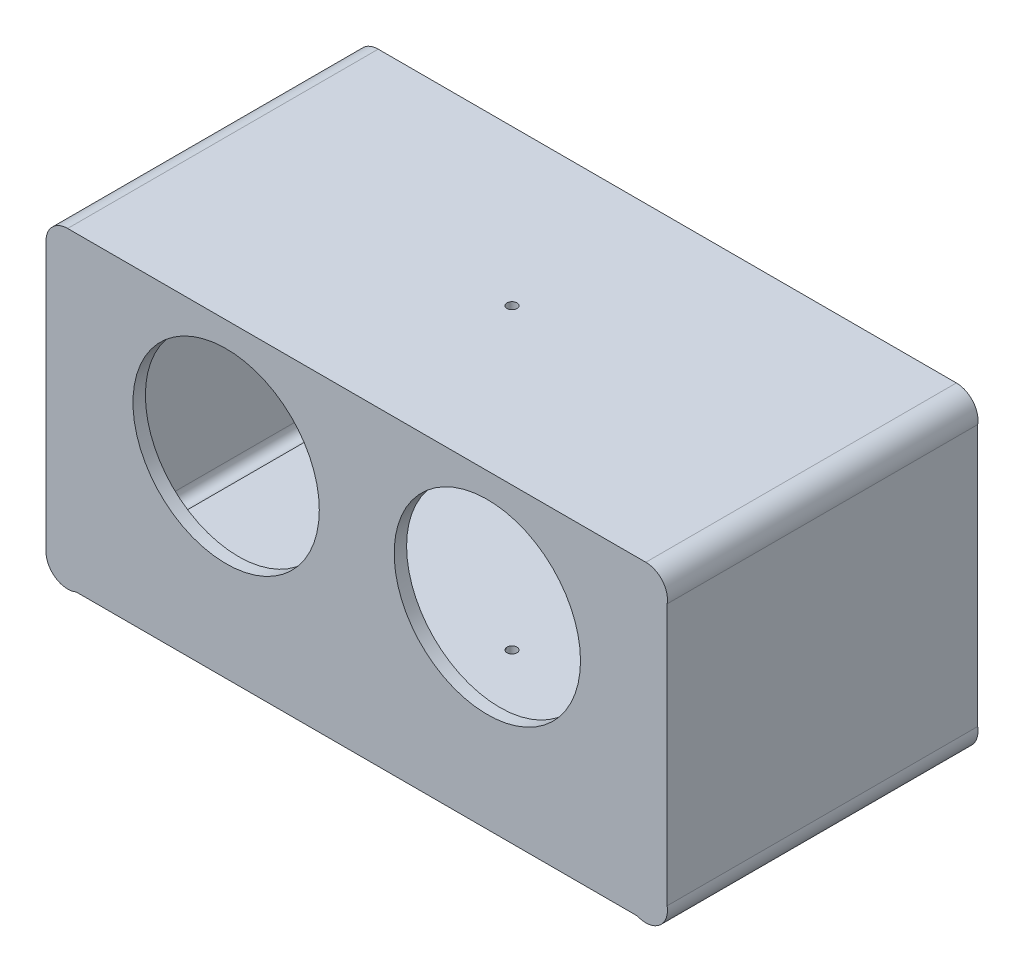
ISO-10303-21;
HEADER;
FILE_DESCRIPTION(('STEP AP214'),'2;1');
FILE_NAME('part.step','',(''),(''),'','','');
FILE_SCHEMA(('AUTOMOTIVE_DESIGN { 1 0 10303 214 1 1 1 1 }'));
ENDSEC;
DATA;
#1=APPLICATION_CONTEXT('core data for automotive mechanical design processes');
#2=APPLICATION_PROTOCOL_DEFINITION('international standard','automotive_design',2000,#1);
#3=PRODUCT_CONTEXT('',#1,'mechanical');
#4=PRODUCT('Part','Part','',(#3));
#5=PRODUCT_RELATED_PRODUCT_CATEGORY('part','',(#4));
#6=PRODUCT_DEFINITION_FORMATION('','',#4);
#7=PRODUCT_DEFINITION_CONTEXT('part definition',#1,'design');
#8=PRODUCT_DEFINITION('design','',#6,#7);
#9=PRODUCT_DEFINITION_SHAPE('','',#8);
#10=(LENGTH_UNIT() NAMED_UNIT(*) SI_UNIT(.MILLI.,.METRE.));
#11=(NAMED_UNIT(*) PLANE_ANGLE_UNIT() SI_UNIT($,.RADIAN.));
#12=(NAMED_UNIT(*) SI_UNIT($,.STERADIAN.) SOLID_ANGLE_UNIT());
#13=UNCERTAINTY_MEASURE_WITH_UNIT(LENGTH_MEASURE(1.E-05),#10,'distance_accuracy_value','');
#14=(GEOMETRIC_REPRESENTATION_CONTEXT(3) GLOBAL_UNCERTAINTY_ASSIGNED_CONTEXT((#13)) GLOBAL_UNIT_ASSIGNED_CONTEXT((#10,
#11,#12)) REPRESENTATION_CONTEXT('',''));
#15=CARTESIAN_POINT('',(0.,0.,0.));
#16=DIRECTION('',(0.,0.,1.));
#17=DIRECTION('',(1.,0.,0.));
#18=AXIS2_PLACEMENT_3D('',#15,#16,#17);
#19=CARTESIAN_POINT('',(14.4867597992989,15.5699993924558,-25.));
#20=DIRECTION('',(0.,0.,1.));
#21=DIRECTION('',(1.,0.,0.));
#22=AXIS2_PLACEMENT_3D('',#19,#20,#21);
#23=CYLINDRICAL_SURFACE('',#22,7.5);
#24=CARTESIAN_POINT('',(14.4867597992989,15.5699993924558,0.));
#25=DIRECTION('',(0.,0.,1.));
#26=DIRECTION('',(1.,0.,0.));
#27=AXIS2_PLACEMENT_3D('',#24,#25,#26);
#28=CIRCLE('',#27,7.5);
#29=CARTESIAN_POINT('',(21.9867597992989,15.5699993924558,0.));
#30=VERTEX_POINT('',#29);
#31=EDGE_CURVE('E168',#30,#30,#28,.T.);
#32=ORIENTED_EDGE('',*,*,#31,.T.);
#33=EDGE_LOOP('',(#32));
#34=FACE_BOUND('',#33,.T.);
#35=CARTESIAN_POINT('',(14.4867597992989,15.5699993924558,-1.));
#36=DIRECTION('',(0.,0.,-1.));
#37=DIRECTION('',(-1.,0.,0.));
#38=AXIS2_PLACEMENT_3D('',#35,#36,#37);
#39=CIRCLE('',#38,7.5);
#40=CARTESIAN_POINT('',(6.98675979929885,15.5699993924558,-1.));
#41=VERTEX_POINT('',#40);
#42=EDGE_CURVE('E152',#41,#41,#39,.F.);
#43=ORIENTED_EDGE('',*,*,#42,.F.);
#44=EDGE_LOOP('',(#43));
#45=FACE_BOUND('',#44,.T.);
#46=ADVANCED_FACE('F39',(#34,#45),#23,.F.);
#47=CARTESIAN_POINT('',(35.5132402007012,15.5699993924558,-25.));
#48=DIRECTION('',(0.,0.,1.));
#49=DIRECTION('',(1.,0.,0.));
#50=AXIS2_PLACEMENT_3D('',#47,#48,#49);
#51=CYLINDRICAL_SURFACE('',#50,7.5);
#52=CARTESIAN_POINT('',(35.5132402007012,15.5699993924558,0.));
#53=DIRECTION('',(0.,0.,1.));
#54=DIRECTION('',(1.,0.,0.));
#55=AXIS2_PLACEMENT_3D('',#52,#53,#54);
#56=CIRCLE('',#55,7.5);
#57=CARTESIAN_POINT('',(43.0132402007011,15.5699993924558,0.));
#58=VERTEX_POINT('',#57);
#59=EDGE_CURVE('E171',#58,#58,#56,.F.);
#60=ORIENTED_EDGE('',*,*,#59,.F.);
#61=EDGE_LOOP('',(#60));
#62=FACE_BOUND('',#61,.T.);
#63=CARTESIAN_POINT('',(35.5132402007012,15.5699993924558,-1.));
#64=DIRECTION('',(0.,0.,-1.));
#65=DIRECTION('',(-1.,0.,0.));
#66=AXIS2_PLACEMENT_3D('',#63,#64,#65);
#67=CIRCLE('',#66,7.5);
#68=CARTESIAN_POINT('',(28.0132402007012,15.5699993924558,-1.));
#69=VERTEX_POINT('',#68);
#70=EDGE_CURVE('E184',#69,#69,#67,.T.);
#71=ORIENTED_EDGE('',*,*,#70,.T.);
#72=EDGE_LOOP('',(#71));
#73=FACE_BOUND('',#72,.T.);
#74=ADVANCED_FACE('F309',(#62,#73),#51,.F.);
#75=CARTESIAN_POINT('',(1.72986892503992,1.67310973328527,-25.));
#76=DIRECTION('',(0.,0.,1.));
#77=DIRECTION('',(1.,0.,0.));
#78=AXIS2_PLACEMENT_3D('',#75,#76,#77);
#79=CYLINDRICAL_SURFACE('',#78,1.74310912574107);
#80=CARTESIAN_POINT('',(1.72986892503992,1.67310973328527,0.));
#81=DIRECTION('',(0.,0.,1.));
#82=DIRECTION('',(1.,0.,0.));
#83=AXIS2_PLACEMENT_3D('',#80,#81,#82);
#84=CIRCLE('',#83,1.74310912574107);
#85=CARTESIAN_POINT('',(2.41431516790148,0.0699993924557774,0.));
#86=VERTEX_POINT('',#85);
#87=CARTESIAN_POINT('',(-0.0132402007011478,1.67310973328528,0.));
#88=VERTEX_POINT('',#87);
#89=EDGE_CURVE('E148',#86,#88,#84,.F.);
#90=ORIENTED_EDGE('',*,*,#89,.T.);
#91=DIRECTION('',(0.,0.,1.));
#92=VECTOR('',#91,1.);
#93=CARTESIAN_POINT('',(-0.0132402007011478,1.67310973328528,-25.));
#94=LINE('',#93,#92);
#95=CARTESIAN_POINT('',(-0.0132402007011478,1.67310973328528,-25.));
#96=VERTEX_POINT('',#95);
#97=EDGE_CURVE('E11',#96,#88,#94,.T.);
#98=ORIENTED_EDGE('',*,*,#97,.F.);
#99=CARTESIAN_POINT('',(1.72986892503992,1.67310973328527,-25.));
#100=DIRECTION('',(0.,0.,1.));
#101=DIRECTION('',(1.,0.,0.));
#102=AXIS2_PLACEMENT_3D('',#99,#100,#101);
#103=CIRCLE('',#102,1.74310912574107);
#104=CARTESIAN_POINT('',(2.41431516790148,0.0699993924557774,-25.));
#105=VERTEX_POINT('',#104);
#106=EDGE_CURVE('E173',#105,#96,#103,.F.);
#107=ORIENTED_EDGE('',*,*,#106,.F.);
#108=DIRECTION('',(0.,0.,1.));
#109=VECTOR('',#108,1.);
#110=CARTESIAN_POINT('',(2.41431516790148,0.0699993924557774,-25.));
#111=LINE('',#110,#109);
#112=EDGE_CURVE('E105',#105,#86,#111,.T.);
#113=ORIENTED_EDGE('',*,*,#112,.T.);
#114=EDGE_LOOP('',(#90,#98,#107,#113));
#115=FACE_BOUND('',#114,.T.);
#116=ADVANCED_FACE('F41',(#115),#79,.T.);
#117=CARTESIAN_POINT('',(-0.0132402007011478,0.,-25.));
#118=DIRECTION('',(1.,0.,0.));
#119=DIRECTION('',(0.,0.,-1.));
#120=AXIS2_PLACEMENT_3D('',#117,#118,#119);
#121=PLANE('',#120);
#122=DIRECTION('',(0.,1.,0.));
#123=VECTOR('',#122,1.);
#124=CARTESIAN_POINT('',(-0.0132402007011478,0.,0.));
#125=LINE('',#124,#123);
#126=CARTESIAN_POINT('',(-0.0132402007011478,23.3268902667147,0.));
#127=VERTEX_POINT('',#126);
#128=EDGE_CURVE('E98',#88,#127,#125,.T.);
#129=ORIENTED_EDGE('',*,*,#128,.T.);
#130=DIRECTION('',(0.,0.,1.));
#131=VECTOR('',#130,1.);
#132=CARTESIAN_POINT('',(-0.0132402007011478,23.3268902667147,-25.));
#133=LINE('',#132,#131);
#134=CARTESIAN_POINT('',(-0.0132402007011478,23.3268902667147,-25.));
#135=VERTEX_POINT('',#134);
#136=EDGE_CURVE('E48',#135,#127,#133,.T.);
#137=ORIENTED_EDGE('',*,*,#136,.F.);
#138=DIRECTION('',(0.,1.,0.));
#139=VECTOR('',#138,1.);
#140=CARTESIAN_POINT('',(-0.0132402007011478,0.,-25.));
#141=LINE('',#140,#139);
#142=EDGE_CURVE('E64',#96,#135,#141,.T.);
#143=ORIENTED_EDGE('',*,*,#142,.F.);
#144=ORIENTED_EDGE('',*,*,#97,.T.);
#145=EDGE_LOOP('',(#129,#137,#143,#144));
#146=FACE_BOUND('',#145,.T.);
#147=ADVANCED_FACE('F301',(#146),#121,.F.);
#148=CARTESIAN_POINT('',(1.72986892503991,23.3268902667147,-25.));
#149=DIRECTION('',(0.,0.,1.));
#150=DIRECTION('',(1.,0.,0.));
#151=AXIS2_PLACEMENT_3D('',#148,#149,#150);
#152=CYLINDRICAL_SURFACE('',#151,1.74310912574106);
#153=CARTESIAN_POINT('',(1.72986892503991,23.3268902667147,0.));
#154=DIRECTION('',(0.,0.,1.));
#155=DIRECTION('',(1.,0.,0.));
#156=AXIS2_PLACEMENT_3D('',#153,#154,#155);
#157=CIRCLE('',#156,1.74310912574106);
#158=CARTESIAN_POINT('',(1.72986892503991,25.0699993924558,0.));
#159=VERTEX_POINT('',#158);
#160=EDGE_CURVE('E130',#159,#127,#157,.T.);
#161=ORIENTED_EDGE('',*,*,#160,.F.);
#162=DIRECTION('',(0.,0.,1.));
#163=VECTOR('',#162,1.);
#164=CARTESIAN_POINT('',(1.72986892503991,25.0699993924558,-25.));
#165=LINE('',#164,#163);
#166=CARTESIAN_POINT('',(1.72986892503991,25.0699993924558,-25.));
#167=VERTEX_POINT('',#166);
#168=EDGE_CURVE('E125',#167,#159,#165,.T.);
#169=ORIENTED_EDGE('',*,*,#168,.F.);
#170=CARTESIAN_POINT('',(1.72986892503991,23.3268902667147,-25.));
#171=DIRECTION('',(0.,0.,1.));
#172=DIRECTION('',(1.,0.,0.));
#173=AXIS2_PLACEMENT_3D('',#170,#171,#172);
#174=CIRCLE('',#173,1.74310912574106);
#175=EDGE_CURVE('E129',#167,#135,#174,.T.);
#176=ORIENTED_EDGE('',*,*,#175,.T.);
#177=ORIENTED_EDGE('',*,*,#136,.T.);
#178=EDGE_LOOP('',(#161,#169,#176,#177));
#179=FACE_BOUND('',#178,.T.);
#180=ADVANCED_FACE('F127',(#179),#152,.T.);
#181=CARTESIAN_POINT('',(0.,25.0699993924558,-25.));
#182=DIRECTION('',(0.,-1.,0.));
#183=DIRECTION('',(1.,0.,0.));
#184=AXIS2_PLACEMENT_3D('',#181,#182,#183);
#185=PLANE('',#184);
#186=CARTESIAN_POINT('',(25.,25.0699993924558,-12.5));
#187=DIRECTION('',(0.,-1.,0.));
#188=DIRECTION('',(1.,0.,0.));
#189=AXIS2_PLACEMENT_3D('',#186,#187,#188);
#190=CIRCLE('',#189,0.400000000000002);
#191=CARTESIAN_POINT('',(25.4,25.0699993924558,-12.5));
#192=VERTEX_POINT('',#191);
#193=EDGE_CURVE('E194',#192,#192,#190,.F.);
#194=ORIENTED_EDGE('',*,*,#193,.F.);
#195=EDGE_LOOP('',(#194));
#196=FACE_BOUND('',#195,.T.);
#197=DIRECTION('',(1.,0.,0.));
#198=VECTOR('',#197,1.);
#199=CARTESIAN_POINT('',(0.,25.0699993924558,0.));
#200=LINE('',#199,#198);
#201=CARTESIAN_POINT('',(48.2701310749601,25.0699993924558,0.));
#202=VERTEX_POINT('',#201);
#203=EDGE_CURVE('E164',#159,#202,#200,.T.);
#204=ORIENTED_EDGE('',*,*,#203,.T.);
#205=DIRECTION('',(0.,0.,1.));
#206=VECTOR('',#205,1.);
#207=CARTESIAN_POINT('',(48.2701310749601,25.0699993924558,-25.));
#208=LINE('',#207,#206);
#209=CARTESIAN_POINT('',(48.2701310749601,25.0699993924558,-25.));
#210=VERTEX_POINT('',#209);
#211=EDGE_CURVE('E133',#210,#202,#208,.T.);
#212=ORIENTED_EDGE('',*,*,#211,.F.);
#213=DIRECTION('',(1.,0.,0.));
#214=VECTOR('',#213,1.);
#215=CARTESIAN_POINT('',(0.,25.0699993924558,-25.));
#216=LINE('',#215,#214);
#217=EDGE_CURVE('E136',#167,#210,#216,.T.);
#218=ORIENTED_EDGE('',*,*,#217,.F.);
#219=ORIENTED_EDGE('',*,*,#168,.T.);
#220=EDGE_LOOP('',(#204,#212,#218,#219));
#221=FACE_BOUND('',#220,.T.);
#222=ADVANCED_FACE('F137',(#196,#221),#185,.F.);
#223=CARTESIAN_POINT('',(48.2701310749601,23.3268902667147,-25.));
#224=DIRECTION('',(0.,0.,1.));
#225=DIRECTION('',(1.,0.,0.));
#226=AXIS2_PLACEMENT_3D('',#223,#224,#225);
#227=CYLINDRICAL_SURFACE('',#226,1.74310912574106);
#228=CARTESIAN_POINT('',(48.2701310749601,23.3268902667147,0.));
#229=DIRECTION('',(0.,0.,1.));
#230=DIRECTION('',(1.,0.,0.));
#231=AXIS2_PLACEMENT_3D('',#228,#229,#230);
#232=CIRCLE('',#231,1.74310912574106);
#233=CARTESIAN_POINT('',(49.9867597992989,23.0242101599736,0.));
#234=VERTEX_POINT('',#233);
#235=EDGE_CURVE('E161',#202,#234,#232,.F.);
#236=ORIENTED_EDGE('',*,*,#235,.T.);
#237=DIRECTION('',(0.,0.,1.));
#238=VECTOR('',#237,1.);
#239=CARTESIAN_POINT('',(49.9867597992989,23.0242101599736,-25.));
#240=LINE('',#239,#238);
#241=CARTESIAN_POINT('',(49.9867597992989,23.0242101599736,-25.));
#242=VERTEX_POINT('',#241);
#243=EDGE_CURVE('E177',#242,#234,#240,.T.);
#244=ORIENTED_EDGE('',*,*,#243,.F.);
#245=CARTESIAN_POINT('',(48.2701310749601,23.3268902667147,-25.));
#246=DIRECTION('',(0.,0.,1.));
#247=DIRECTION('',(1.,0.,0.));
#248=AXIS2_PLACEMENT_3D('',#245,#246,#247);
#249=CIRCLE('',#248,1.74310912574106);
#250=EDGE_CURVE('E141',#210,#242,#249,.F.);
#251=ORIENTED_EDGE('',*,*,#250,.F.);
#252=ORIENTED_EDGE('',*,*,#211,.T.);
#253=EDGE_LOOP('',(#236,#244,#251,#252));
#254=FACE_BOUND('',#253,.T.);
#255=ADVANCED_FACE('F287',(#254),#227,.T.);
#256=CARTESIAN_POINT('',(49.9867597992989,0.,-25.));
#257=DIRECTION('',(1.,0.,0.));
#258=DIRECTION('',(0.,0.,-1.));
#259=AXIS2_PLACEMENT_3D('',#256,#257,#258);
#260=PLANE('',#259);
#261=DIRECTION('',(0.,1.,0.));
#262=VECTOR('',#261,1.);
#263=CARTESIAN_POINT('',(49.9867597992989,0.,0.));
#264=LINE('',#263,#262);
#265=CARTESIAN_POINT('',(49.9867597992989,1.97578984002642,0.));
#266=VERTEX_POINT('',#265);
#267=EDGE_CURVE('E158',#266,#234,#264,.T.);
#268=ORIENTED_EDGE('',*,*,#267,.F.);
#269=DIRECTION('',(0.,0.,1.));
#270=VECTOR('',#269,1.);
#271=CARTESIAN_POINT('',(49.9867597992989,1.97578984002642,-25.));
#272=LINE('',#271,#270);
#273=CARTESIAN_POINT('',(49.9867597992989,1.97578984002642,-25.));
#274=VERTEX_POINT('',#273);
#275=EDGE_CURVE('E179',#274,#266,#272,.T.);
#276=ORIENTED_EDGE('',*,*,#275,.F.);
#277=DIRECTION('',(0.,1.,0.));
#278=VECTOR('',#277,1.);
#279=CARTESIAN_POINT('',(49.9867597992989,0.,-25.));
#280=LINE('',#279,#278);
#281=EDGE_CURVE('E281',#274,#242,#280,.T.);
#282=ORIENTED_EDGE('',*,*,#281,.T.);
#283=ORIENTED_EDGE('',*,*,#243,.T.);
#284=EDGE_LOOP('',(#268,#276,#282,#283));
#285=FACE_BOUND('',#284,.T.);
#286=ADVANCED_FACE('F291',(#285),#260,.T.);
#287=CARTESIAN_POINT('',(48.2701310749601,1.67310973328528,-25.));
#288=DIRECTION('',(0.,0.,1.));
#289=DIRECTION('',(1.,0.,0.));
#290=AXIS2_PLACEMENT_3D('',#287,#288,#289);
#291=CYLINDRICAL_SURFACE('',#290,1.74310912574106);
#292=CARTESIAN_POINT('',(48.2701310749601,1.67310973328528,0.));
#293=DIRECTION('',(0.,0.,1.));
#294=DIRECTION('',(1.,0.,0.));
#295=AXIS2_PLACEMENT_3D('',#292,#293,#294);
#296=CIRCLE('',#295,1.74310912574106);
#297=CARTESIAN_POINT('',(47.5856848320985,0.0699993924557829,0.));
#298=VERTEX_POINT('',#297);
#299=EDGE_CURVE('E155',#298,#266,#296,.T.);
#300=ORIENTED_EDGE('',*,*,#299,.F.);
#301=DIRECTION('',(0.,0.,1.));
#302=VECTOR('',#301,1.);
#303=CARTESIAN_POINT('',(47.5856848320985,0.0699993924557829,-25.));
#304=LINE('',#303,#302);
#305=CARTESIAN_POINT('',(47.5856848320985,0.0699993924557829,-25.));
#306=VERTEX_POINT('',#305);
#307=EDGE_CURVE('E181',#306,#298,#304,.T.);
#308=ORIENTED_EDGE('',*,*,#307,.F.);
#309=CARTESIAN_POINT('',(48.2701310749601,1.67310973328528,-25.));
#310=DIRECTION('',(0.,0.,1.));
#311=DIRECTION('',(1.,0.,0.));
#312=AXIS2_PLACEMENT_3D('',#309,#310,#311);
#313=CIRCLE('',#312,1.74310912574106);
#314=EDGE_CURVE('E278',#306,#274,#313,.T.);
#315=ORIENTED_EDGE('',*,*,#314,.T.);
#316=ORIENTED_EDGE('',*,*,#275,.T.);
#317=EDGE_LOOP('',(#300,#308,#315,#316));
#318=FACE_BOUND('',#317,.T.);
#319=ADVANCED_FACE('F294',(#318),#291,.T.);
#320=CARTESIAN_POINT('',(0.,0.0699993924557771,-25.));
#321=DIRECTION('',(0.,-1.,0.));
#322=DIRECTION('',(1.,0.,0.));
#323=AXIS2_PLACEMENT_3D('',#320,#321,#322);
#324=PLANE('',#323);
#325=CARTESIAN_POINT('',(25.,0.0699993924557801,-12.5));
#326=DIRECTION('',(0.,-1.,0.));
#327=DIRECTION('',(1.,0.,0.));
#328=AXIS2_PLACEMENT_3D('',#325,#326,#327);
#329=CIRCLE('',#328,7.);
#330=CARTESIAN_POINT('',(32.,0.069999392455781,-12.5));
#331=VERTEX_POINT('',#330);
#332=EDGE_CURVE('E197',#331,#331,#329,.T.);
#333=ORIENTED_EDGE('',*,*,#332,.F.);
#334=EDGE_LOOP('',(#333));
#335=FACE_BOUND('',#334,.T.);
#336=DIRECTION('',(1.,0.,0.));
#337=VECTOR('',#336,1.);
#338=CARTESIAN_POINT('',(0.,0.0699993924557771,0.));
#339=LINE('',#338,#337);
#340=EDGE_CURVE('E151',#86,#298,#339,.T.);
#341=ORIENTED_EDGE('',*,*,#340,.F.);
#342=ORIENTED_EDGE('',*,*,#112,.F.);
#343=DIRECTION('',(1.,0.,0.));
#344=VECTOR('',#343,1.);
#345=CARTESIAN_POINT('',(0.,0.0699993924557771,-25.));
#346=LINE('',#345,#344);
#347=EDGE_CURVE('E276',#105,#306,#346,.T.);
#348=ORIENTED_EDGE('',*,*,#347,.T.);
#349=ORIENTED_EDGE('',*,*,#307,.T.);
#350=EDGE_LOOP('',(#341,#342,#348,#349));
#351=FACE_BOUND('',#350,.T.);
#352=ADVANCED_FACE('F296',(#335,#351),#324,.T.);
#353=CARTESIAN_POINT('',(0.,0.,-25.));
#354=DIRECTION('',(0.,0.,1.));
#355=DIRECTION('',(1.,0.,0.));
#356=AXIS2_PLACEMENT_3D('',#353,#354,#355);
#357=PLANE('',#356);
#358=DIRECTION('',(0.,1.,0.));
#359=VECTOR('',#358,1.);
#360=CARTESIAN_POINT('',(0.986759799298856,1.67310973328527,-25.));
#361=LINE('',#360,#359);
#362=CARTESIAN_POINT('',(0.986759799298856,1.67310973328527,-25.));
#363=VERTEX_POINT('',#362);
#364=CARTESIAN_POINT('',(0.986759799298852,23.3268902667147,-25.));
#365=VERTEX_POINT('',#364);
#366=EDGE_CURVE('E233',#363,#365,#361,.T.);
#367=ORIENTED_EDGE('',*,*,#366,.F.);
#368=CARTESIAN_POINT('',(1.72986892503992,1.67310973328527,-25.));
#369=DIRECTION('',(0.,0.,-1.));
#370=DIRECTION('',(-1.,0.,0.));
#371=AXIS2_PLACEMENT_3D('',#368,#369,#370);
#372=CIRCLE('',#371,0.743109125741534);
#373=CARTESIAN_POINT('',(2.16399919298443,1.06999939245578,-25.));
#374=VERTEX_POINT('',#373);
#375=EDGE_CURVE('E56',#374,#363,#372,.T.);
#376=ORIENTED_EDGE('',*,*,#375,.F.);
#377=DIRECTION('',(-1.,0.,0.));
#378=VECTOR('',#377,1.);
#379=CARTESIAN_POINT('',(47.8360008070156,1.06999939245578,-25.));
#380=LINE('',#379,#378);
#381=CARTESIAN_POINT('',(47.8360008070156,1.06999939245578,-25.));
#382=VERTEX_POINT('',#381);
#383=EDGE_CURVE('E210',#382,#374,#380,.T.);
#384=ORIENTED_EDGE('',*,*,#383,.F.);
#385=CARTESIAN_POINT('',(48.2701310749601,1.67310973328528,-25.));
#386=DIRECTION('',(0.,0.,-1.));
#387=DIRECTION('',(-1.,0.,0.));
#388=AXIS2_PLACEMENT_3D('',#385,#386,#387);
#389=CIRCLE('',#388,0.743109125742055);
#390=CARTESIAN_POINT('',(48.9867597992988,1.86971706838189,-25.));
#391=VERTEX_POINT('',#390);
#392=EDGE_CURVE('E248',#391,#382,#389,.T.);
#393=ORIENTED_EDGE('',*,*,#392,.F.);
#394=DIRECTION('',(0.,-1.,0.));
#395=VECTOR('',#394,1.);
#396=CARTESIAN_POINT('',(48.9867597992989,23.1302829316181,-25.));
#397=LINE('',#396,#395);
#398=CARTESIAN_POINT('',(48.9867597992989,23.1302829316181,-25.));
#399=VERTEX_POINT('',#398);
#400=EDGE_CURVE('E245',#399,#391,#397,.T.);
#401=ORIENTED_EDGE('',*,*,#400,.F.);
#402=CARTESIAN_POINT('',(48.2701310749601,23.3268902667147,-25.));
#403=DIRECTION('',(0.,0.,-1.));
#404=DIRECTION('',(-1.,0.,0.));
#405=AXIS2_PLACEMENT_3D('',#402,#403,#404);
#406=CIRCLE('',#405,0.743109125741587);
#407=CARTESIAN_POINT('',(48.2701310749601,24.0699993924563,-25.));
#408=VERTEX_POINT('',#407);
#409=EDGE_CURVE('E242',#408,#399,#406,.T.);
#410=ORIENTED_EDGE('',*,*,#409,.F.);
#411=DIRECTION('',(1.,0.,0.));
#412=VECTOR('',#411,1.);
#413=CARTESIAN_POINT('',(1.72986892503991,24.0699993924558,-25.));
#414=LINE('',#413,#412);
#415=CARTESIAN_POINT('',(1.72986892503991,24.0699993924558,-25.));
#416=VERTEX_POINT('',#415);
#417=EDGE_CURVE('E239',#416,#408,#414,.T.);
#418=ORIENTED_EDGE('',*,*,#417,.F.);
#419=CARTESIAN_POINT('',(1.72986892503991,23.3268902667147,-25.));
#420=DIRECTION('',(0.,0.,-1.));
#421=DIRECTION('',(-1.,0.,0.));
#422=AXIS2_PLACEMENT_3D('',#419,#420,#421);
#423=CIRCLE('',#422,0.743109125741062);
#424=EDGE_CURVE('E236',#365,#416,#423,.T.);
#425=ORIENTED_EDGE('',*,*,#424,.F.);
#426=EDGE_LOOP('',(#367,#376,#384,#393,#401,#410,#418,#425));
#427=FACE_BOUND('',#426,.T.);
#428=ORIENTED_EDGE('',*,*,#106,.T.);
#429=ORIENTED_EDGE('',*,*,#142,.T.);
#430=ORIENTED_EDGE('',*,*,#175,.F.);
#431=ORIENTED_EDGE('',*,*,#217,.T.);
#432=ORIENTED_EDGE('',*,*,#250,.T.);
#433=ORIENTED_EDGE('',*,*,#281,.F.);
#434=ORIENTED_EDGE('',*,*,#314,.F.);
#435=ORIENTED_EDGE('',*,*,#347,.F.);
#436=EDGE_LOOP('',(#428,#429,#430,#431,#432,#433,#434,#435));
#437=FACE_BOUND('',#436,.T.);
#438=ADVANCED_FACE('F143',(#427,#437),#357,.F.);
#439=CARTESIAN_POINT('',(0.,0.,0.));
#440=DIRECTION('',(0.,0.,1.));
#441=DIRECTION('',(1.,0.,0.));
#442=AXIS2_PLACEMENT_3D('',#439,#440,#441);
#443=PLANE('',#442);
#444=ORIENTED_EDGE('',*,*,#89,.F.);
#445=ORIENTED_EDGE('',*,*,#340,.T.);
#446=ORIENTED_EDGE('',*,*,#299,.T.);
#447=ORIENTED_EDGE('',*,*,#267,.T.);
#448=ORIENTED_EDGE('',*,*,#235,.F.);
#449=ORIENTED_EDGE('',*,*,#203,.F.);
#450=ORIENTED_EDGE('',*,*,#160,.T.);
#451=ORIENTED_EDGE('',*,*,#128,.F.);
#452=EDGE_LOOP('',(#444,#445,#446,#447,#448,#449,#450,#451));
#453=FACE_BOUND('',#452,.T.);
#454=ORIENTED_EDGE('',*,*,#31,.F.);
#455=EDGE_LOOP('',(#454));
#456=FACE_BOUND('',#455,.T.);
#457=ORIENTED_EDGE('',*,*,#59,.T.);
#458=EDGE_LOOP('',(#457));
#459=FACE_BOUND('',#458,.T.);
#460=ADVANCED_FACE('F297',(#453,#456,#459),#443,.T.);
#461=CARTESIAN_POINT('',(1.72986892503992,1.67310973328527,-1.));
#462=DIRECTION('',(0.,0.,-1.));
#463=DIRECTION('',(-1.,0.,0.));
#464=AXIS2_PLACEMENT_3D('',#461,#462,#463);
#465=PLANE('',#464);
#466=ORIENTED_EDGE('',*,*,#70,.F.);
#467=EDGE_LOOP('',(#466));
#468=FACE_BOUND('',#467,.T.);
#469=CARTESIAN_POINT('',(1.72986892503992,1.67310973328527,-1.));
#470=DIRECTION('',(0.,0.,-1.));
#471=DIRECTION('',(-1.,0.,0.));
#472=AXIS2_PLACEMENT_3D('',#469,#470,#471);
#473=CIRCLE('',#472,0.743109125741534);
#474=CARTESIAN_POINT('',(2.16399919298443,1.06999939245578,-1.));
#475=VERTEX_POINT('',#474);
#476=CARTESIAN_POINT('',(0.986759799298856,1.67310973328527,-1.));
#477=VERTEX_POINT('',#476);
#478=EDGE_CURVE('E206',#475,#477,#473,.T.);
#479=ORIENTED_EDGE('',*,*,#478,.T.);
#480=DIRECTION('',(0.,1.,0.));
#481=VECTOR('',#480,1.);
#482=CARTESIAN_POINT('',(0.986759799298856,1.67310973328527,-1.));
#483=LINE('',#482,#481);
#484=CARTESIAN_POINT('',(0.986759799298852,23.3268902667147,-1.));
#485=VERTEX_POINT('',#484);
#486=EDGE_CURVE('E209',#477,#485,#483,.T.);
#487=ORIENTED_EDGE('',*,*,#486,.T.);
#488=CARTESIAN_POINT('',(1.72986892503991,23.3268902667147,-1.));
#489=DIRECTION('',(0.,0.,-1.));
#490=DIRECTION('',(-1.,0.,0.));
#491=AXIS2_PLACEMENT_3D('',#488,#489,#490);
#492=CIRCLE('',#491,0.743109125741062);
#493=CARTESIAN_POINT('',(1.72986892503991,24.0699993924558,-1.));
#494=VERTEX_POINT('',#493);
#495=EDGE_CURVE('E213',#485,#494,#492,.T.);
#496=ORIENTED_EDGE('',*,*,#495,.T.);
#497=DIRECTION('',(1.,0.,0.));
#498=VECTOR('',#497,1.);
#499=CARTESIAN_POINT('',(1.72986892503991,24.0699993924558,-1.));
#500=LINE('',#499,#498);
#501=CARTESIAN_POINT('',(48.2701310749601,24.0699993924563,-1.));
#502=VERTEX_POINT('',#501);
#503=EDGE_CURVE('E216',#494,#502,#500,.T.);
#504=ORIENTED_EDGE('',*,*,#503,.T.);
#505=CARTESIAN_POINT('',(48.2701310749601,23.3268902667147,-1.));
#506=DIRECTION('',(0.,0.,-1.));
#507=DIRECTION('',(-1.,0.,0.));
#508=AXIS2_PLACEMENT_3D('',#505,#506,#507);
#509=CIRCLE('',#508,0.743109125741587);
#510=CARTESIAN_POINT('',(48.9867597992989,23.1302829316181,-1.));
#511=VERTEX_POINT('',#510);
#512=EDGE_CURVE('E219',#502,#511,#509,.T.);
#513=ORIENTED_EDGE('',*,*,#512,.T.);
#514=DIRECTION('',(0.,-1.,0.));
#515=VECTOR('',#514,1.);
#516=CARTESIAN_POINT('',(48.9867597992989,23.1302829316181,-1.));
#517=LINE('',#516,#515);
#518=CARTESIAN_POINT('',(48.9867597992988,1.86971706838189,-1.));
#519=VERTEX_POINT('',#518);
#520=EDGE_CURVE('E222',#511,#519,#517,.T.);
#521=ORIENTED_EDGE('',*,*,#520,.T.);
#522=CARTESIAN_POINT('',(48.2701310749601,1.67310973328528,-1.));
#523=DIRECTION('',(0.,0.,-1.));
#524=DIRECTION('',(-1.,0.,0.));
#525=AXIS2_PLACEMENT_3D('',#522,#523,#524);
#526=CIRCLE('',#525,0.743109125742055);
#527=CARTESIAN_POINT('',(47.8360008070156,1.06999939245578,-1.));
#528=VERTEX_POINT('',#527);
#529=EDGE_CURVE('E225',#519,#528,#526,.T.);
#530=ORIENTED_EDGE('',*,*,#529,.T.);
#531=DIRECTION('',(-1.,0.,0.));
#532=VECTOR('',#531,1.);
#533=CARTESIAN_POINT('',(47.8360008070156,1.06999939245578,-1.));
#534=LINE('',#533,#532);
#535=EDGE_CURVE('E228',#528,#475,#534,.T.);
#536=ORIENTED_EDGE('',*,*,#535,.T.);
#537=EDGE_LOOP('',(#479,#487,#496,#504,#513,#521,#530,#536));
#538=FACE_BOUND('',#537,.T.);
#539=ORIENTED_EDGE('',*,*,#42,.T.);
#540=EDGE_LOOP('',(#539));
#541=FACE_BOUND('',#540,.T.);
#542=ADVANCED_FACE('F322',(#468,#538,#541),#465,.T.);
#543=CARTESIAN_POINT('',(1.72986892503992,1.67310973328527,-1.));
#544=DIRECTION('',(0.,0.,-1.));
#545=DIRECTION('',(-1.,0.,0.));
#546=AXIS2_PLACEMENT_3D('',#543,#544,#545);
#547=CYLINDRICAL_SURFACE('',#546,0.743109125741534);
#548=ORIENTED_EDGE('',*,*,#375,.T.);
#549=DIRECTION('',(0.,0.,-1.));
#550=VECTOR('',#549,1.);
#551=CARTESIAN_POINT('',(0.986759799298856,1.67310973328527,-1.));
#552=LINE('',#551,#550);
#553=EDGE_CURVE('E231',#477,#363,#552,.T.);
#554=ORIENTED_EDGE('',*,*,#553,.F.);
#555=ORIENTED_EDGE('',*,*,#478,.F.);
#556=DIRECTION('',(0.,0.,-1.));
#557=VECTOR('',#556,1.);
#558=CARTESIAN_POINT('',(2.16399919298443,1.06999939245578,-1.));
#559=LINE('',#558,#557);
#560=EDGE_CURVE('E186',#475,#374,#559,.T.);
#561=ORIENTED_EDGE('',*,*,#560,.T.);
#562=EDGE_LOOP('',(#548,#554,#555,#561));
#563=FACE_BOUND('',#562,.T.);
#564=ADVANCED_FACE('F326',(#563),#547,.F.);
#565=CARTESIAN_POINT('',(47.8360008070156,1.06999939245578,-1.));
#566=DIRECTION('',(0.,-1.,0.));
#567=DIRECTION('',(1.,0.,0.));
#568=AXIS2_PLACEMENT_3D('',#565,#566,#567);
#569=PLANE('',#568);
#570=CARTESIAN_POINT('',(25.,1.06999939245578,-12.5));
#571=DIRECTION('',(0.,-1.,0.));
#572=DIRECTION('',(1.,0.,0.));
#573=AXIS2_PLACEMENT_3D('',#570,#571,#572);
#574=CIRCLE('',#573,0.400000000000002);
#575=CARTESIAN_POINT('',(25.4,1.06999939245578,-12.5));
#576=VERTEX_POINT('',#575);
#577=EDGE_CURVE('E189',#576,#576,#574,.F.);
#578=ORIENTED_EDGE('',*,*,#577,.F.);
#579=EDGE_LOOP('',(#578));
#580=FACE_BOUND('',#579,.T.);
#581=ORIENTED_EDGE('',*,*,#383,.T.);
#582=ORIENTED_EDGE('',*,*,#560,.F.);
#583=ORIENTED_EDGE('',*,*,#535,.F.);
#584=DIRECTION('',(0.,0.,-1.));
#585=VECTOR('',#584,1.);
#586=CARTESIAN_POINT('',(47.8360008070156,1.06999939245578,-1.));
#587=LINE('',#586,#585);
#588=EDGE_CURVE('E254',#528,#382,#587,.T.);
#589=ORIENTED_EDGE('',*,*,#588,.T.);
#590=EDGE_LOOP('',(#581,#582,#583,#589));
#591=FACE_BOUND('',#590,.T.);
#592=ADVANCED_FACE('F329',(#580,#591),#569,.F.);
#593=CARTESIAN_POINT('',(48.2701310749601,1.67310973328528,-1.));
#594=DIRECTION('',(0.,0.,-1.));
#595=DIRECTION('',(-1.,0.,0.));
#596=AXIS2_PLACEMENT_3D('',#593,#594,#595);
#597=CYLINDRICAL_SURFACE('',#596,0.743109125742055);
#598=ORIENTED_EDGE('',*,*,#392,.T.);
#599=ORIENTED_EDGE('',*,*,#588,.F.);
#600=ORIENTED_EDGE('',*,*,#529,.F.);
#601=DIRECTION('',(0.,0.,-1.));
#602=VECTOR('',#601,1.);
#603=CARTESIAN_POINT('',(48.9867597992988,1.86971706838189,-1.));
#604=LINE('',#603,#602);
#605=EDGE_CURVE('E257',#519,#391,#604,.T.);
#606=ORIENTED_EDGE('',*,*,#605,.T.);
#607=EDGE_LOOP('',(#598,#599,#600,#606));
#608=FACE_BOUND('',#607,.T.);
#609=ADVANCED_FACE('F350',(#608),#597,.F.);
#610=CARTESIAN_POINT('',(48.9867597992989,23.1302829316181,-1.));
#611=DIRECTION('',(1.,0.,0.));
#612=DIRECTION('',(0.,0.,-1.));
#613=AXIS2_PLACEMENT_3D('',#610,#611,#612);
#614=PLANE('',#613);
#615=ORIENTED_EDGE('',*,*,#400,.T.);
#616=ORIENTED_EDGE('',*,*,#605,.F.);
#617=ORIENTED_EDGE('',*,*,#520,.F.);
#618=DIRECTION('',(0.,0.,-1.));
#619=VECTOR('',#618,1.);
#620=CARTESIAN_POINT('',(48.9867597992989,23.1302829316181,-1.));
#621=LINE('',#620,#619);
#622=EDGE_CURVE('E260',#511,#399,#621,.T.);
#623=ORIENTED_EDGE('',*,*,#622,.T.);
#624=EDGE_LOOP('',(#615,#616,#617,#623));
#625=FACE_BOUND('',#624,.T.);
#626=ADVANCED_FACE('F346',(#625),#614,.F.);
#627=CARTESIAN_POINT('',(48.2701310749601,23.3268902667147,-1.));
#628=DIRECTION('',(0.,0.,-1.));
#629=DIRECTION('',(-1.,0.,0.));
#630=AXIS2_PLACEMENT_3D('',#627,#628,#629);
#631=CYLINDRICAL_SURFACE('',#630,0.743109125741587);
#632=ORIENTED_EDGE('',*,*,#409,.T.);
#633=ORIENTED_EDGE('',*,*,#622,.F.);
#634=ORIENTED_EDGE('',*,*,#512,.F.);
#635=DIRECTION('',(0.,0.,-1.));
#636=VECTOR('',#635,1.);
#637=CARTESIAN_POINT('',(48.2701310749601,24.0699993924563,-1.));
#638=LINE('',#637,#636);
#639=EDGE_CURVE('E263',#502,#408,#638,.T.);
#640=ORIENTED_EDGE('',*,*,#639,.T.);
#641=EDGE_LOOP('',(#632,#633,#634,#640));
#642=FACE_BOUND('',#641,.T.);
#643=ADVANCED_FACE('F342',(#642),#631,.F.);
#644=CARTESIAN_POINT('',(1.72986892503991,24.0699993924558,-1.));
#645=DIRECTION('',(0.,1.,0.));
#646=DIRECTION('',(-1.,0.,0.));
#647=AXIS2_PLACEMENT_3D('',#644,#645,#646);
#648=PLANE('',#647);
#649=CARTESIAN_POINT('',(25.,24.0699993924558,-12.5));
#650=DIRECTION('',(0.,1.,0.));
#651=DIRECTION('',(-1.,0.,0.));
#652=AXIS2_PLACEMENT_3D('',#649,#650,#651);
#653=CIRCLE('',#652,0.400000000000002);
#654=CARTESIAN_POINT('',(24.6,24.0699993924558,-12.5));
#655=VERTEX_POINT('',#654);
#656=EDGE_CURVE('E187',#655,#655,#653,.F.);
#657=ORIENTED_EDGE('',*,*,#656,.F.);
#658=EDGE_LOOP('',(#657));
#659=FACE_BOUND('',#658,.T.);
#660=ORIENTED_EDGE('',*,*,#417,.T.);
#661=ORIENTED_EDGE('',*,*,#639,.F.);
#662=ORIENTED_EDGE('',*,*,#503,.F.);
#663=DIRECTION('',(0.,0.,-1.));
#664=VECTOR('',#663,1.);
#665=CARTESIAN_POINT('',(1.72986892503991,24.0699993924558,-1.));
#666=LINE('',#665,#664);
#667=EDGE_CURVE('E266',#494,#416,#666,.T.);
#668=ORIENTED_EDGE('',*,*,#667,.T.);
#669=EDGE_LOOP('',(#660,#661,#662,#668));
#670=FACE_BOUND('',#669,.T.);
#671=ADVANCED_FACE('F338',(#659,#670),#648,.F.);
#672=CARTESIAN_POINT('',(1.72986892503991,23.3268902667147,-1.));
#673=DIRECTION('',(0.,0.,-1.));
#674=DIRECTION('',(-1.,0.,0.));
#675=AXIS2_PLACEMENT_3D('',#672,#673,#674);
#676=CYLINDRICAL_SURFACE('',#675,0.743109125741062);
#677=ORIENTED_EDGE('',*,*,#424,.T.);
#678=ORIENTED_EDGE('',*,*,#667,.F.);
#679=ORIENTED_EDGE('',*,*,#495,.F.);
#680=DIRECTION('',(0.,0.,-1.));
#681=VECTOR('',#680,1.);
#682=CARTESIAN_POINT('',(0.986759799298852,23.3268902667147,-1.));
#683=LINE('',#682,#681);
#684=EDGE_CURVE('E269',#485,#365,#683,.T.);
#685=ORIENTED_EDGE('',*,*,#684,.T.);
#686=EDGE_LOOP('',(#677,#678,#679,#685));
#687=FACE_BOUND('',#686,.T.);
#688=ADVANCED_FACE('F334',(#687),#676,.F.);
#689=CARTESIAN_POINT('',(0.986759799298856,1.67310973328527,-1.));
#690=DIRECTION('',(-1.,0.,0.));
#691=DIRECTION('',(0.,-1.,0.));
#692=AXIS2_PLACEMENT_3D('',#689,#690,#691);
#693=PLANE('',#692);
#694=ORIENTED_EDGE('',*,*,#366,.T.);
#695=ORIENTED_EDGE('',*,*,#684,.F.);
#696=ORIENTED_EDGE('',*,*,#486,.F.);
#697=ORIENTED_EDGE('',*,*,#553,.T.);
#698=EDGE_LOOP('',(#694,#695,#696,#697));
#699=FACE_BOUND('',#698,.T.);
#700=ADVANCED_FACE('F330',(#699),#693,.F.);
#701=CARTESIAN_POINT('',(25.,-26.9300006075442,-12.5));
#702=DIRECTION('',(0.,1.,0.));
#703=DIRECTION('',(-1.,0.,0.));
#704=AXIS2_PLACEMENT_3D('',#701,#702,#703);
#705=CYLINDRICAL_SURFACE('',#704,0.400000000000002);
#706=ORIENTED_EDGE('',*,*,#656,.T.);
#707=EDGE_LOOP('',(#706));
#708=FACE_BOUND('',#707,.T.);
#709=ORIENTED_EDGE('',*,*,#193,.T.);
#710=EDGE_LOOP('',(#709));
#711=FACE_BOUND('',#710,.T.);
#712=ADVANCED_FACE('F333',(#708,#711),#705,.F.);
#713=ORIENTED_EDGE('',*,*,#577,.T.);
#714=EDGE_LOOP('',(#713));
#715=FACE_BOUND('',#714,.T.);
#716=CARTESIAN_POINT('',(25.,-0.93000060754422,-12.5));
#717=DIRECTION('',(0.,-1.,0.));
#718=DIRECTION('',(1.,0.,0.));
#719=AXIS2_PLACEMENT_3D('',#716,#717,#718);
#720=CIRCLE('',#719,0.400000000000002);
#721=CARTESIAN_POINT('',(25.4,-0.93000060754422,-12.5));
#722=VERTEX_POINT('',#721);
#723=EDGE_CURVE('E43',#722,#722,#720,.T.);
#724=ORIENTED_EDGE('',*,*,#723,.T.);
#725=EDGE_LOOP('',(#724));
#726=FACE_BOUND('',#725,.T.);
#727=ADVANCED_FACE('F363',(#715,#726),#705,.F.);
#728=CARTESIAN_POINT('',(25.,-0.93000060754422,-12.5));
#729=DIRECTION('',(0.,1.,0.));
#730=DIRECTION('',(-1.,0.,0.));
#731=AXIS2_PLACEMENT_3D('',#728,#729,#730);
#732=CYLINDRICAL_SURFACE('',#731,7.);
#733=CARTESIAN_POINT('',(25.,-0.93000060754422,-12.5));
#734=DIRECTION('',(0.,-1.,0.));
#735=DIRECTION('',(1.,0.,0.));
#736=AXIS2_PLACEMENT_3D('',#733,#734,#735);
#737=CIRCLE('',#736,7.);
#738=CARTESIAN_POINT('',(32.,-0.930000607544219,-12.5));
#739=VERTEX_POINT('',#738);
#740=EDGE_CURVE('E190',#739,#739,#737,.T.);
#741=ORIENTED_EDGE('',*,*,#740,.F.);
#742=EDGE_LOOP('',(#741));
#743=FACE_BOUND('',#742,.T.);
#744=ORIENTED_EDGE('',*,*,#332,.T.);
#745=EDGE_LOOP('',(#744));
#746=FACE_BOUND('',#745,.T.);
#747=ADVANCED_FACE('F364',(#743,#746),#732,.T.);
#748=CARTESIAN_POINT('',(25.,-0.93000060754422,-12.5));
#749=DIRECTION('',(0.,-1.,0.));
#750=DIRECTION('',(1.,0.,0.));
#751=AXIS2_PLACEMENT_3D('',#748,#749,#750);
#752=PLANE('',#751);
#753=ORIENTED_EDGE('',*,*,#723,.F.);
#754=EDGE_LOOP('',(#753));
#755=FACE_BOUND('',#754,.T.);
#756=ORIENTED_EDGE('',*,*,#740,.T.);
#757=EDGE_LOOP('',(#756));
#758=FACE_BOUND('',#757,.T.);
#759=ADVANCED_FACE('F367',(#755,#758),#752,.T.);
#760=CLOSED_SHELL('',(#46,#74,#116,#147,#180,#222,#255,#286,#319,#352,#438,#460,#542,#564,#592,
#609,#626,#643,#671,#688,#700,#712,#727,#747,#759));
#761=MANIFOLD_SOLID_BREP('B2',#760);
#762=ADVANCED_BREP_SHAPE_REPRESENTATION('',(#18,#761),#14);
#763=SHAPE_DEFINITION_REPRESENTATION(#9,#762);
ENDSEC;
END-ISO-10303-21;
